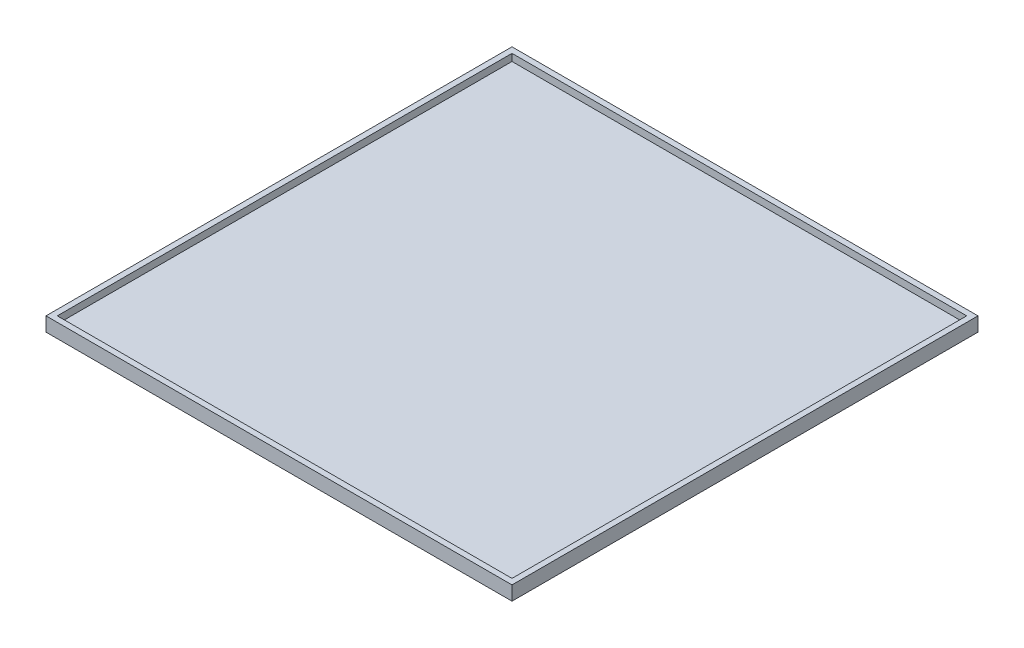
ISO-10303-21;
HEADER;
FILE_DESCRIPTION(('STEP AP214'),'2;1');
FILE_NAME('part.step','',(''),(''),'','','');
FILE_SCHEMA(('AUTOMOTIVE_DESIGN { 1 0 10303 214 1 1 1 1 }'));
ENDSEC;
DATA;
#1=APPLICATION_CONTEXT('core data for automotive mechanical design processes');
#2=APPLICATION_PROTOCOL_DEFINITION('international standard','automotive_design',2000,#1);
#3=PRODUCT_CONTEXT('',#1,'mechanical');
#4=PRODUCT('Part','Part','',(#3));
#5=PRODUCT_RELATED_PRODUCT_CATEGORY('part','',(#4));
#6=PRODUCT_DEFINITION_FORMATION('','',#4);
#7=PRODUCT_DEFINITION_CONTEXT('part definition',#1,'design');
#8=PRODUCT_DEFINITION('design','',#6,#7);
#9=PRODUCT_DEFINITION_SHAPE('','',#8);
#10=(LENGTH_UNIT() NAMED_UNIT(*) SI_UNIT(.MILLI.,.METRE.));
#11=(NAMED_UNIT(*) PLANE_ANGLE_UNIT() SI_UNIT($,.RADIAN.));
#12=(NAMED_UNIT(*) SI_UNIT($,.STERADIAN.) SOLID_ANGLE_UNIT());
#13=UNCERTAINTY_MEASURE_WITH_UNIT(LENGTH_MEASURE(1.E-05),#10,'distance_accuracy_value','');
#14=(GEOMETRIC_REPRESENTATION_CONTEXT(3) GLOBAL_UNCERTAINTY_ASSIGNED_CONTEXT((#13)) GLOBAL_UNIT_ASSIGNED_CONTEXT((#10,
#11,#12)) REPRESENTATION_CONTEXT('',''));
#15=CARTESIAN_POINT('',(0.,0.,0.));
#16=DIRECTION('',(0.,0.,1.));
#17=DIRECTION('',(1.,0.,0.));
#18=AXIS2_PLACEMENT_3D('',#15,#16,#17);
#19=CARTESIAN_POINT('',(104.775,6.35,104.775));
#20=DIRECTION('',(-1.,0.,0.));
#21=DIRECTION('',(0.,0.,1.));
#22=AXIS2_PLACEMENT_3D('',#19,#20,#21);
#23=PLANE('',#22);
#24=DIRECTION('',(0.,0.,-1.));
#25=VECTOR('',#24,1.);
#26=CARTESIAN_POINT('',(104.775,0.,104.775));
#27=LINE('',#26,#25);
#28=CARTESIAN_POINT('',(104.775,0.,104.775));
#29=VERTEX_POINT('',#28);
#30=CARTESIAN_POINT('',(104.775,0.,-104.775));
#31=VERTEX_POINT('',#30);
#32=EDGE_CURVE('E164',#29,#31,#27,.T.);
#33=ORIENTED_EDGE('',*,*,#32,.T.);
#34=DIRECTION('',(0.,-1.,0.));
#35=VECTOR('',#34,1.);
#36=CARTESIAN_POINT('',(104.775,6.35,-104.775));
#37=LINE('',#36,#35);
#38=CARTESIAN_POINT('',(104.775,6.35,-104.775));
#39=VERTEX_POINT('',#38);
#40=EDGE_CURVE('E11',#39,#31,#37,.T.);
#41=ORIENTED_EDGE('',*,*,#40,.F.);
#42=DIRECTION('',(0.,0.,-1.));
#43=VECTOR('',#42,1.);
#44=CARTESIAN_POINT('',(104.775,6.35,104.775));
#45=LINE('',#44,#43);
#46=CARTESIAN_POINT('',(104.775,6.35,104.775));
#47=VERTEX_POINT('',#46);
#48=EDGE_CURVE('E170',#47,#39,#45,.T.);
#49=ORIENTED_EDGE('',*,*,#48,.F.);
#50=DIRECTION('',(0.,-1.,0.));
#51=VECTOR('',#50,1.);
#52=CARTESIAN_POINT('',(104.775,6.35,104.775));
#53=LINE('',#52,#51);
#54=EDGE_CURVE('E180',#47,#29,#53,.T.);
#55=ORIENTED_EDGE('',*,*,#54,.T.);
#56=EDGE_LOOP('',(#33,#41,#49,#55));
#57=FACE_BOUND('',#56,.T.);
#58=ADVANCED_FACE('F45',(#57),#23,.F.);
#59=CARTESIAN_POINT('',(-104.775,6.35,-104.775));
#60=DIRECTION('',(0.,0.,1.));
#61=DIRECTION('',(1.,0.,0.));
#62=AXIS2_PLACEMENT_3D('',#59,#60,#61);
#63=PLANE('',#62);
#64=DIRECTION('',(-1.,0.,0.));
#65=VECTOR('',#64,1.);
#66=CARTESIAN_POINT('',(-104.775,0.,-104.775));
#67=LINE('',#66,#65);
#68=CARTESIAN_POINT('',(-104.775,0.,-104.775));
#69=VERTEX_POINT('',#68);
#70=EDGE_CURVE('E184',#31,#69,#67,.T.);
#71=ORIENTED_EDGE('',*,*,#70,.T.);
#72=DIRECTION('',(0.,-1.,0.));
#73=VECTOR('',#72,1.);
#74=CARTESIAN_POINT('',(-104.775,6.35,-104.775));
#75=LINE('',#74,#73);
#76=CARTESIAN_POINT('',(-104.775,6.35,-104.775));
#77=VERTEX_POINT('',#76);
#78=EDGE_CURVE('E53',#77,#69,#75,.T.);
#79=ORIENTED_EDGE('',*,*,#78,.F.);
#80=DIRECTION('',(-1.,0.,0.));
#81=VECTOR('',#80,1.);
#82=CARTESIAN_POINT('',(-104.775,6.35,-104.775));
#83=LINE('',#82,#81);
#84=EDGE_CURVE('E97',#39,#77,#83,.T.);
#85=ORIENTED_EDGE('',*,*,#84,.F.);
#86=ORIENTED_EDGE('',*,*,#40,.T.);
#87=EDGE_LOOP('',(#71,#79,#85,#86));
#88=FACE_BOUND('',#87,.T.);
#89=ADVANCED_FACE('F220',(#88),#63,.F.);
#90=CARTESIAN_POINT('',(-104.775,6.35,104.775));
#91=DIRECTION('',(1.,0.,0.));
#92=DIRECTION('',(0.,0.,-1.));
#93=AXIS2_PLACEMENT_3D('',#90,#91,#92);
#94=PLANE('',#93);
#95=DIRECTION('',(0.,0.,1.));
#96=VECTOR('',#95,1.);
#97=CARTESIAN_POINT('',(-104.775,0.,104.775));
#98=LINE('',#97,#96);
#99=CARTESIAN_POINT('',(-104.775,0.,104.775));
#100=VERTEX_POINT('',#99);
#101=EDGE_CURVE('E187',#69,#100,#98,.T.);
#102=ORIENTED_EDGE('',*,*,#101,.T.);
#103=DIRECTION('',(0.,-1.,0.));
#104=VECTOR('',#103,1.);
#105=CARTESIAN_POINT('',(-104.775,6.35,104.775));
#106=LINE('',#105,#104);
#107=CARTESIAN_POINT('',(-104.775,6.35,104.775));
#108=VERTEX_POINT('',#107);
#109=EDGE_CURVE('E194',#108,#100,#106,.T.);
#110=ORIENTED_EDGE('',*,*,#109,.F.);
#111=DIRECTION('',(0.,0.,1.));
#112=VECTOR('',#111,1.);
#113=CARTESIAN_POINT('',(-104.775,6.35,104.775));
#114=LINE('',#113,#112);
#115=EDGE_CURVE('E175',#77,#108,#114,.T.);
#116=ORIENTED_EDGE('',*,*,#115,.F.);
#117=ORIENTED_EDGE('',*,*,#78,.T.);
#118=EDGE_LOOP('',(#102,#110,#116,#117));
#119=FACE_BOUND('',#118,.T.);
#120=ADVANCED_FACE('F201',(#119),#94,.F.);
#121=CARTESIAN_POINT('',(-104.775,6.35,104.775));
#122=DIRECTION('',(0.,0.,-1.));
#123=DIRECTION('',(-1.,0.,0.));
#124=AXIS2_PLACEMENT_3D('',#121,#122,#123);
#125=PLANE('',#124);
#126=DIRECTION('',(1.,0.,0.));
#127=VECTOR('',#126,1.);
#128=CARTESIAN_POINT('',(-104.775,0.,104.775));
#129=LINE('',#128,#127);
#130=EDGE_CURVE('E90',#100,#29,#129,.T.);
#131=ORIENTED_EDGE('',*,*,#130,.T.);
#132=ORIENTED_EDGE('',*,*,#54,.F.);
#133=DIRECTION('',(1.,0.,0.));
#134=VECTOR('',#133,1.);
#135=CARTESIAN_POINT('',(-104.775,6.35,104.775));
#136=LINE('',#135,#134);
#137=EDGE_CURVE('E69',#108,#47,#136,.T.);
#138=ORIENTED_EDGE('',*,*,#137,.F.);
#139=ORIENTED_EDGE('',*,*,#109,.T.);
#140=EDGE_LOOP('',(#131,#132,#138,#139));
#141=FACE_BOUND('',#140,.T.);
#142=ADVANCED_FACE('F209',(#141),#125,.F.);
#143=CARTESIAN_POINT('',(0.,6.35,0.));
#144=DIRECTION('',(0.,-1.,0.));
#145=DIRECTION('',(0.,0.,-1.));
#146=AXIS2_PLACEMENT_3D('',#143,#144,#145);
#147=PLANE('',#146);
#148=DIRECTION('',(-1.,0.,0.));
#149=VECTOR('',#148,1.);
#150=CARTESIAN_POINT('',(-102.235,6.35,-102.235));
#151=LINE('',#150,#149);
#152=CARTESIAN_POINT('',(102.235,6.35,-102.235));
#153=VERTEX_POINT('',#152);
#154=CARTESIAN_POINT('',(-102.235,6.35,-102.235));
#155=VERTEX_POINT('',#154);
#156=EDGE_CURVE('E155',#153,#155,#151,.T.);
#157=ORIENTED_EDGE('',*,*,#156,.F.);
#158=DIRECTION('',(0.,0.,-1.));
#159=VECTOR('',#158,1.);
#160=CARTESIAN_POINT('',(102.235,6.35,102.235));
#161=LINE('',#160,#159);
#162=CARTESIAN_POINT('',(102.235,6.35,102.235));
#163=VERTEX_POINT('',#162);
#164=EDGE_CURVE('E60',#163,#153,#161,.T.);
#165=ORIENTED_EDGE('',*,*,#164,.F.);
#166=DIRECTION('',(1.,0.,0.));
#167=VECTOR('',#166,1.);
#168=CARTESIAN_POINT('',(-102.235,6.35,102.235));
#169=LINE('',#168,#167);
#170=CARTESIAN_POINT('',(-102.235,6.35,102.235));
#171=VERTEX_POINT('',#170);
#172=EDGE_CURVE('E142',#171,#163,#169,.T.);
#173=ORIENTED_EDGE('',*,*,#172,.F.);
#174=DIRECTION('',(0.,0.,1.));
#175=VECTOR('',#174,1.);
#176=CARTESIAN_POINT('',(-102.235,6.35,102.235));
#177=LINE('',#176,#175);
#178=EDGE_CURVE('E146',#155,#171,#177,.T.);
#179=ORIENTED_EDGE('',*,*,#178,.F.);
#180=EDGE_LOOP('',(#157,#165,#173,#179));
#181=FACE_BOUND('',#180,.T.);
#182=ORIENTED_EDGE('',*,*,#48,.T.);
#183=ORIENTED_EDGE('',*,*,#84,.T.);
#184=ORIENTED_EDGE('',*,*,#115,.T.);
#185=ORIENTED_EDGE('',*,*,#137,.T.);
#186=EDGE_LOOP('',(#182,#183,#184,#185));
#187=FACE_BOUND('',#186,.T.);
#188=ADVANCED_FACE('F211',(#181,#187),#147,.F.);
#189=CARTESIAN_POINT('',(0.,0.,0.));
#190=DIRECTION('',(0.,-1.,0.));
#191=DIRECTION('',(0.,0.,-1.));
#192=AXIS2_PLACEMENT_3D('',#189,#190,#191);
#193=PLANE('',#192);
#194=ORIENTED_EDGE('',*,*,#32,.F.);
#195=ORIENTED_EDGE('',*,*,#130,.F.);
#196=ORIENTED_EDGE('',*,*,#101,.F.);
#197=ORIENTED_EDGE('',*,*,#70,.F.);
#198=EDGE_LOOP('',(#194,#195,#196,#197));
#199=FACE_BOUND('',#198,.T.);
#200=ADVANCED_FACE('F205',(#199),#193,.T.);
#201=CARTESIAN_POINT('',(102.235,3.175,102.235));
#202=DIRECTION('',(1.,0.,0.));
#203=DIRECTION('',(0.,0.,-1.));
#204=AXIS2_PLACEMENT_3D('',#201,#202,#203);
#205=PLANE('',#204);
#206=ORIENTED_EDGE('',*,*,#164,.T.);
#207=DIRECTION('',(0.,1.,0.));
#208=VECTOR('',#207,1.);
#209=CARTESIAN_POINT('',(102.235,3.175,-102.235));
#210=LINE('',#209,#208);
#211=CARTESIAN_POINT('',(102.235,3.175,-102.235));
#212=VERTEX_POINT('',#211);
#213=EDGE_CURVE('E117',#212,#153,#210,.T.);
#214=ORIENTED_EDGE('',*,*,#213,.F.);
#215=DIRECTION('',(0.,0.,-1.));
#216=VECTOR('',#215,1.);
#217=CARTESIAN_POINT('',(102.235,3.175,102.235));
#218=LINE('',#217,#216);
#219=CARTESIAN_POINT('',(102.235,3.175,102.235));
#220=VERTEX_POINT('',#219);
#221=EDGE_CURVE('E121',#220,#212,#218,.T.);
#222=ORIENTED_EDGE('',*,*,#221,.F.);
#223=DIRECTION('',(0.,1.,0.));
#224=VECTOR('',#223,1.);
#225=CARTESIAN_POINT('',(102.235,3.175,102.235));
#226=LINE('',#225,#224);
#227=EDGE_CURVE('E161',#220,#163,#226,.T.);
#228=ORIENTED_EDGE('',*,*,#227,.T.);
#229=EDGE_LOOP('',(#206,#214,#222,#228));
#230=FACE_BOUND('',#229,.T.);
#231=ADVANCED_FACE('F119',(#230),#205,.F.);
#232=CARTESIAN_POINT('',(-102.235,3.175,102.235));
#233=DIRECTION('',(0.,0.,1.));
#234=DIRECTION('',(1.,0.,0.));
#235=AXIS2_PLACEMENT_3D('',#232,#233,#234);
#236=PLANE('',#235);
#237=ORIENTED_EDGE('',*,*,#172,.T.);
#238=ORIENTED_EDGE('',*,*,#227,.F.);
#239=DIRECTION('',(1.,0.,0.));
#240=VECTOR('',#239,1.);
#241=CARTESIAN_POINT('',(-102.235,3.175,102.235));
#242=LINE('',#241,#240);
#243=CARTESIAN_POINT('',(-102.235,3.175,102.235));
#244=VERTEX_POINT('',#243);
#245=EDGE_CURVE('E128',#244,#220,#242,.T.);
#246=ORIENTED_EDGE('',*,*,#245,.F.);
#247=DIRECTION('',(0.,1.,0.));
#248=VECTOR('',#247,1.);
#249=CARTESIAN_POINT('',(-102.235,3.175,102.235));
#250=LINE('',#249,#248);
#251=EDGE_CURVE('E165',#244,#171,#250,.T.);
#252=ORIENTED_EDGE('',*,*,#251,.T.);
#253=EDGE_LOOP('',(#237,#238,#246,#252));
#254=FACE_BOUND('',#253,.T.);
#255=ADVANCED_FACE('F260',(#254),#236,.F.);
#256=CARTESIAN_POINT('',(-102.235,3.175,102.235));
#257=DIRECTION('',(-1.,0.,0.));
#258=DIRECTION('',(0.,0.,1.));
#259=AXIS2_PLACEMENT_3D('',#256,#257,#258);
#260=PLANE('',#259);
#261=ORIENTED_EDGE('',*,*,#178,.T.);
#262=ORIENTED_EDGE('',*,*,#251,.F.);
#263=DIRECTION('',(0.,0.,1.));
#264=VECTOR('',#263,1.);
#265=CARTESIAN_POINT('',(-102.235,3.175,102.235));
#266=LINE('',#265,#264);
#267=CARTESIAN_POINT('',(-102.235,3.175,-102.235));
#268=VERTEX_POINT('',#267);
#269=EDGE_CURVE('E137',#268,#244,#266,.T.);
#270=ORIENTED_EDGE('',*,*,#269,.F.);
#271=DIRECTION('',(0.,1.,0.));
#272=VECTOR('',#271,1.);
#273=CARTESIAN_POINT('',(-102.235,3.175,-102.235));
#274=LINE('',#273,#272);
#275=EDGE_CURVE('E127',#268,#155,#274,.T.);
#276=ORIENTED_EDGE('',*,*,#275,.T.);
#277=EDGE_LOOP('',(#261,#262,#270,#276));
#278=FACE_BOUND('',#277,.T.);
#279=ADVANCED_FACE('F269',(#278),#260,.F.);
#280=CARTESIAN_POINT('',(-102.235,3.175,-102.235));
#281=DIRECTION('',(0.,0.,-1.));
#282=DIRECTION('',(-1.,0.,0.));
#283=AXIS2_PLACEMENT_3D('',#280,#281,#282);
#284=PLANE('',#283);
#285=ORIENTED_EDGE('',*,*,#156,.T.);
#286=ORIENTED_EDGE('',*,*,#275,.F.);
#287=DIRECTION('',(-1.,0.,0.));
#288=VECTOR('',#287,1.);
#289=CARTESIAN_POINT('',(-102.235,3.175,-102.235));
#290=LINE('',#289,#288);
#291=EDGE_CURVE('E131',#212,#268,#290,.T.);
#292=ORIENTED_EDGE('',*,*,#291,.F.);
#293=ORIENTED_EDGE('',*,*,#213,.T.);
#294=EDGE_LOOP('',(#285,#286,#292,#293));
#295=FACE_BOUND('',#294,.T.);
#296=ADVANCED_FACE('F132',(#295),#284,.F.);
#297=CARTESIAN_POINT('',(0.,3.175,0.));
#298=DIRECTION('',(0.,-1.,0.));
#299=DIRECTION('',(0.,0.,-1.));
#300=AXIS2_PLACEMENT_3D('',#297,#298,#299);
#301=PLANE('',#300);
#302=ORIENTED_EDGE('',*,*,#221,.T.);
#303=ORIENTED_EDGE('',*,*,#291,.T.);
#304=ORIENTED_EDGE('',*,*,#269,.T.);
#305=ORIENTED_EDGE('',*,*,#245,.T.);
#306=EDGE_LOOP('',(#302,#303,#304,#305));
#307=FACE_BOUND('',#306,.T.);
#308=ADVANCED_FACE('F139',(#307),#301,.F.);
#309=CLOSED_SHELL('',(#58,#89,#120,#142,#188,#200,#231,#255,#279,#296,#308));
#310=MANIFOLD_SOLID_BREP('B2',#309);
#311=ADVANCED_BREP_SHAPE_REPRESENTATION('',(#18,#310),#14);
#312=SHAPE_DEFINITION_REPRESENTATION(#9,#311);
ENDSEC;
END-ISO-10303-21;
